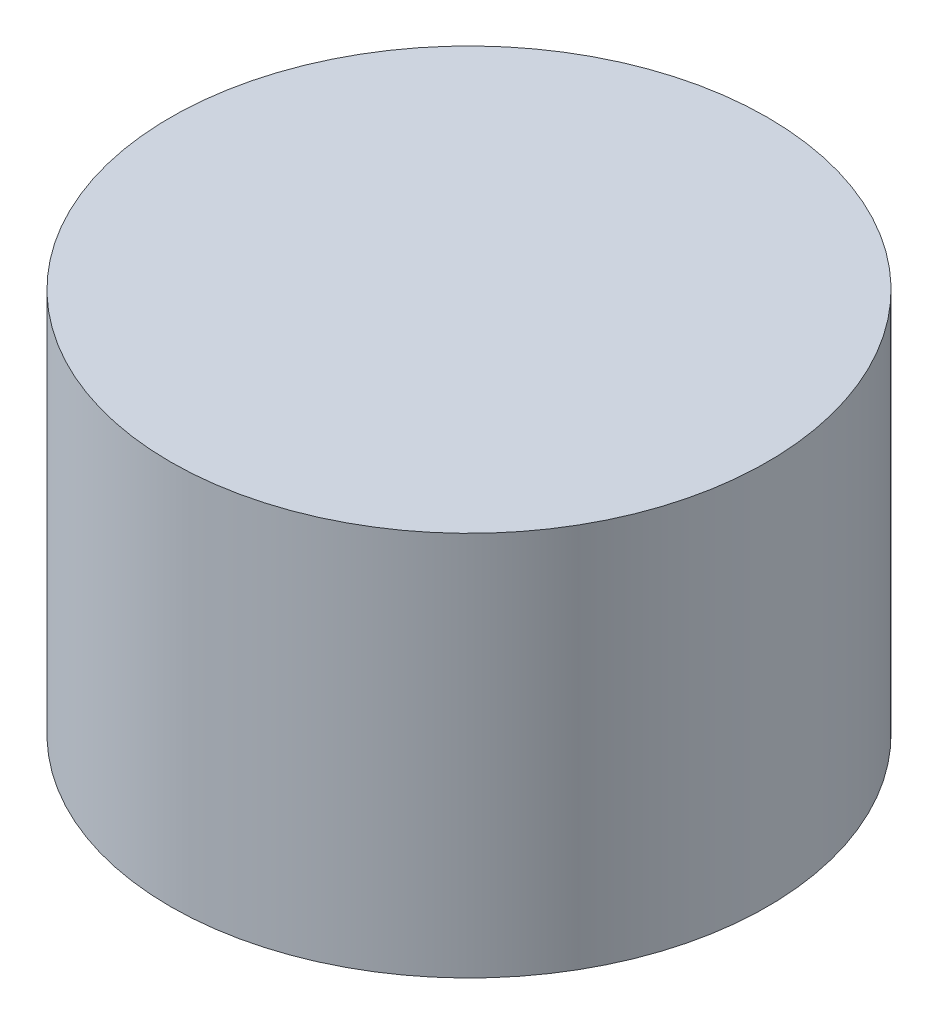
ISO-10303-21;
HEADER;
FILE_DESCRIPTION(('STEP AP214'),'2;1');
FILE_NAME('part.step','',(''),(''),'','','');
FILE_SCHEMA(('AUTOMOTIVE_DESIGN { 1 0 10303 214 1 1 1 1 }'));
ENDSEC;
DATA;
#1=APPLICATION_CONTEXT('core data for automotive mechanical design processes');
#2=APPLICATION_PROTOCOL_DEFINITION('international standard','automotive_design',2000,#1);
#3=PRODUCT_CONTEXT('',#1,'mechanical');
#4=PRODUCT('Part','Part','',(#3));
#5=PRODUCT_RELATED_PRODUCT_CATEGORY('part','',(#4));
#6=PRODUCT_DEFINITION_FORMATION('','',#4);
#7=PRODUCT_DEFINITION_CONTEXT('part definition',#1,'design');
#8=PRODUCT_DEFINITION('design','',#6,#7);
#9=PRODUCT_DEFINITION_SHAPE('','',#8);
#10=(LENGTH_UNIT() NAMED_UNIT(*) SI_UNIT(.MILLI.,.METRE.));
#11=(NAMED_UNIT(*) PLANE_ANGLE_UNIT() SI_UNIT($,.RADIAN.));
#12=(NAMED_UNIT(*) SI_UNIT($,.STERADIAN.) SOLID_ANGLE_UNIT());
#13=UNCERTAINTY_MEASURE_WITH_UNIT(LENGTH_MEASURE(1.E-05),#10,'distance_accuracy_value','');
#14=(GEOMETRIC_REPRESENTATION_CONTEXT(3) GLOBAL_UNCERTAINTY_ASSIGNED_CONTEXT((#13)) GLOBAL_UNIT_ASSIGNED_CONTEXT((#10,
#11,#12)) REPRESENTATION_CONTEXT('',''));
#15=CARTESIAN_POINT('',(0.,0.,0.));
#16=DIRECTION('',(0.,0.,1.));
#17=DIRECTION('',(1.,0.,0.));
#18=AXIS2_PLACEMENT_3D('',#15,#16,#17);
#19=CARTESIAN_POINT('',(0.,10.,0.));
#20=DIRECTION('',(0.,-1.,0.));
#21=DIRECTION('',(0.,0.,-1.));
#22=AXIS2_PLACEMENT_3D('',#19,#20,#21);
#23=CYLINDRICAL_SURFACE('',#22,7.75);
#24=CARTESIAN_POINT('',(0.,10.,0.));
#25=DIRECTION('',(0.,1.,0.));
#26=DIRECTION('',(0.,0.,1.));
#27=AXIS2_PLACEMENT_3D('',#24,#25,#26);
#28=CIRCLE('',#27,7.75);
#29=CARTESIAN_POINT('',(0.,10.,7.75));
#30=VERTEX_POINT('',#29);
#31=EDGE_CURVE('E10',#30,#30,#28,.T.);
#32=ORIENTED_EDGE('',*,*,#31,.F.);
#33=EDGE_LOOP('',(#32));
#34=FACE_BOUND('',#33,.T.);
#35=CARTESIAN_POINT('',(0.,0.,0.));
#36=DIRECTION('',(0.,1.,0.));
#37=DIRECTION('',(0.,0.,1.));
#38=AXIS2_PLACEMENT_3D('',#35,#36,#37);
#39=CIRCLE('',#38,7.75);
#40=CARTESIAN_POINT('',(0.,0.,7.75));
#41=VERTEX_POINT('',#40);
#42=EDGE_CURVE('E34',#41,#41,#39,.T.);
#43=ORIENTED_EDGE('',*,*,#42,.T.);
#44=EDGE_LOOP('',(#43));
#45=FACE_BOUND('',#44,.T.);
#46=ADVANCED_FACE('F31',(#34,#45),#23,.T.);
#47=CARTESIAN_POINT('',(0.,10.,0.));
#48=DIRECTION('',(0.,1.,0.));
#49=DIRECTION('',(0.,0.,1.));
#50=AXIS2_PLACEMENT_3D('',#47,#48,#49);
#51=PLANE('',#50);
#52=ORIENTED_EDGE('',*,*,#31,.T.);
#53=EDGE_LOOP('',(#52));
#54=FACE_BOUND('',#53,.T.);
#55=ADVANCED_FACE('F46',(#54),#51,.T.);
#56=CARTESIAN_POINT('',(0.,0.,0.));
#57=DIRECTION('',(0.,1.,0.));
#58=DIRECTION('',(0.,0.,1.));
#59=AXIS2_PLACEMENT_3D('',#56,#57,#58);
#60=PLANE('',#59);
#61=ORIENTED_EDGE('',*,*,#42,.F.);
#62=EDGE_LOOP('',(#61));
#63=FACE_BOUND('',#62,.T.);
#64=ADVANCED_FACE('F44',(#63),#60,.F.);
#65=CLOSED_SHELL('',(#46,#55,#64));
#66=MANIFOLD_SOLID_BREP('B2',#65);
#67=ADVANCED_BREP_SHAPE_REPRESENTATION('',(#18,#66),#14);
#68=SHAPE_DEFINITION_REPRESENTATION(#9,#67);
ENDSEC;
END-ISO-10303-21;
